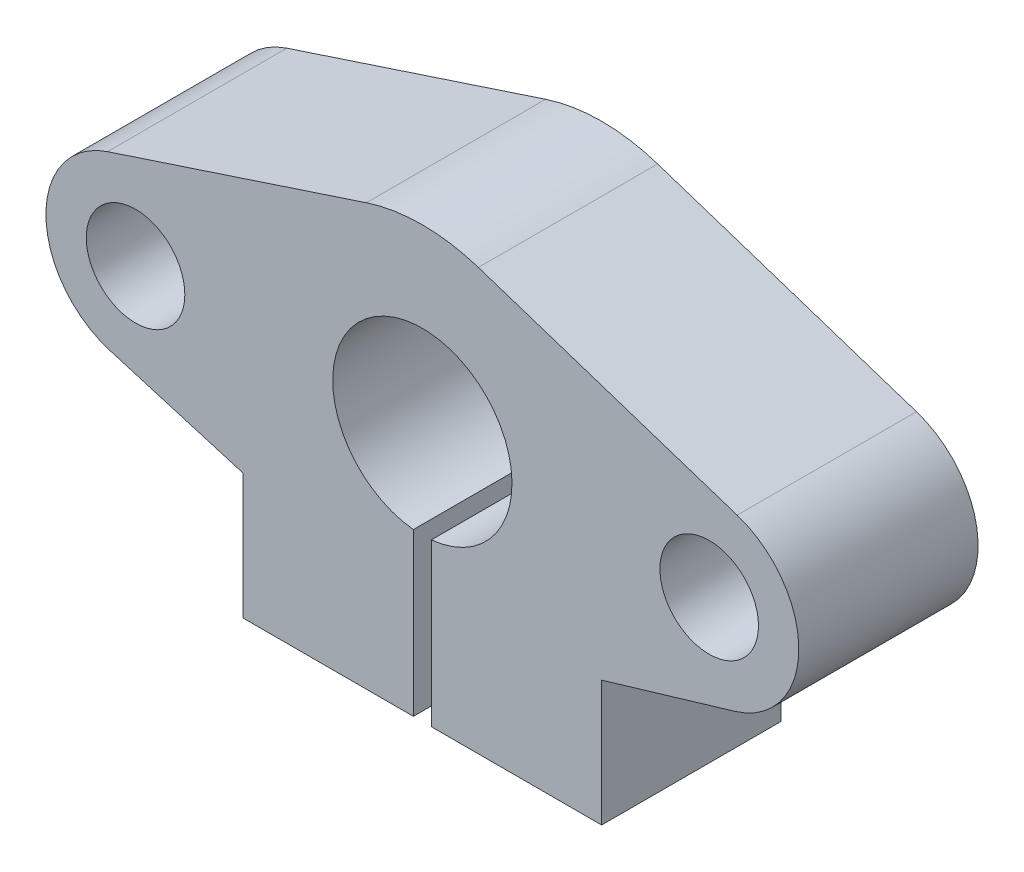
ISO-10303-21;
HEADER;
FILE_DESCRIPTION(('STEP AP214'),'2;1');
FILE_NAME('part.step','',(''),(''),'','','');
FILE_SCHEMA(('AUTOMOTIVE_DESIGN { 1 0 10303 214 1 1 1 1 }'));
ENDSEC;
DATA;
#1=APPLICATION_CONTEXT('core data for automotive mechanical design processes');
#2=APPLICATION_PROTOCOL_DEFINITION('international standard','automotive_design',2000,#1);
#3=PRODUCT_CONTEXT('',#1,'mechanical');
#4=PRODUCT('Part','Part','',(#3));
#5=PRODUCT_RELATED_PRODUCT_CATEGORY('part','',(#4));
#6=PRODUCT_DEFINITION_FORMATION('','',#4);
#7=PRODUCT_DEFINITION_CONTEXT('part definition',#1,'design');
#8=PRODUCT_DEFINITION('design','',#6,#7);
#9=PRODUCT_DEFINITION_SHAPE('','',#8);
#10=(LENGTH_UNIT() NAMED_UNIT(*) SI_UNIT(.MILLI.,.METRE.));
#11=(NAMED_UNIT(*) PLANE_ANGLE_UNIT() SI_UNIT($,.RADIAN.));
#12=(NAMED_UNIT(*) SI_UNIT($,.STERADIAN.) SOLID_ANGLE_UNIT());
#13=UNCERTAINTY_MEASURE_WITH_UNIT(LENGTH_MEASURE(1.E-05),#10,'distance_accuracy_value','');
#14=(GEOMETRIC_REPRESENTATION_CONTEXT(3) GLOBAL_UNCERTAINTY_ASSIGNED_CONTEXT((#13)) GLOBAL_UNIT_ASSIGNED_CONTEXT((#10,
#11,#12)) REPRESENTATION_CONTEXT('',''));
#15=CARTESIAN_POINT('',(0.,0.,0.));
#16=DIRECTION('',(0.,0.,1.));
#17=DIRECTION('',(1.,0.,0.));
#18=AXIS2_PLACEMENT_3D('',#15,#16,#17);
#19=CARTESIAN_POINT('',(0.,0.,10.));
#20=DIRECTION('',(0.,0.,-1.));
#21=DIRECTION('',(-1.,0.,0.));
#22=AXIS2_PLACEMENT_3D('',#19,#20,#21);
#23=CYLINDRICAL_SURFACE('',#22,10.);
#24=CARTESIAN_POINT('',(0.,0.,0.));
#25=DIRECTION('',(0.,0.,1.));
#26=DIRECTION('',(1.,0.,0.));
#27=AXIS2_PLACEMENT_3D('',#24,#25,#26);
#28=CIRCLE('',#27,10.);
#29=CARTESIAN_POINT('',(3.125,9.49917759598166,0.));
#30=VERTEX_POINT('',#29);
#31=CARTESIAN_POINT('',(-3.125,9.49917759598166,0.));
#32=VERTEX_POINT('',#31);
#33=EDGE_CURVE('E176',#30,#32,#28,.T.);
#34=ORIENTED_EDGE('',*,*,#33,.T.);
#35=DIRECTION('',(0.,0.,-1.));
#36=VECTOR('',#35,1.);
#37=CARTESIAN_POINT('',(-3.125,9.49917759598166,10.));
#38=LINE('',#37,#36);
#39=CARTESIAN_POINT('',(-3.125,9.49917759598166,10.));
#40=VERTEX_POINT('',#39);
#41=EDGE_CURVE('E11',#40,#32,#38,.T.);
#42=ORIENTED_EDGE('',*,*,#41,.F.);
#43=CARTESIAN_POINT('',(0.,0.,10.));
#44=DIRECTION('',(0.,0.,1.));
#45=DIRECTION('',(1.,0.,0.));
#46=AXIS2_PLACEMENT_3D('',#43,#44,#45);
#47=CIRCLE('',#46,10.);
#48=CARTESIAN_POINT('',(3.125,9.49917759598166,10.));
#49=VERTEX_POINT('',#48);
#50=EDGE_CURVE('E110',#49,#40,#47,.T.);
#51=ORIENTED_EDGE('',*,*,#50,.F.);
#52=DIRECTION('',(0.,0.,-1.));
#53=VECTOR('',#52,1.);
#54=CARTESIAN_POINT('',(3.125,9.49917759598166,10.));
#55=LINE('',#54,#53);
#56=EDGE_CURVE('E54',#49,#30,#55,.T.);
#57=ORIENTED_EDGE('',*,*,#56,.T.);
#58=EDGE_LOOP('',(#34,#42,#51,#57));
#59=FACE_BOUND('',#58,.T.);
#60=ADVANCED_FACE('F38',(#59),#23,.T.);
#61=CARTESIAN_POINT('',(-3.125,9.49917759598167,10.));
#62=DIRECTION('',(-0.3125,0.949917759598166,0.));
#63=DIRECTION('',(-0.949917759598166,-0.3125,0.));
#64=AXIS2_PLACEMENT_3D('',#61,#62,#63);
#65=PLANE('',#64);
#66=DIRECTION('',(0.949917759598166,0.3125,0.));
#67=VECTOR('',#66,1.);
#68=CARTESIAN_POINT('',(-3.125,9.49917759598167,0.));
#69=LINE('',#68,#67);
#70=CARTESIAN_POINT('',(-17.5625,4.74958879799083,0.));
#71=VERTEX_POINT('',#70);
#72=EDGE_CURVE('E178',#71,#32,#69,.T.);
#73=ORIENTED_EDGE('',*,*,#72,.F.);
#74=DIRECTION('',(0.,0.,-1.));
#75=VECTOR('',#74,1.);
#76=CARTESIAN_POINT('',(-17.5625,4.74958879799083,10.));
#77=LINE('',#76,#75);
#78=CARTESIAN_POINT('',(-17.5625,4.74958879799083,10.));
#79=VERTEX_POINT('',#78);
#80=EDGE_CURVE('E46',#79,#71,#77,.T.);
#81=ORIENTED_EDGE('',*,*,#80,.F.);
#82=DIRECTION('',(0.949917759598166,0.3125,0.));
#83=VECTOR('',#82,1.);
#84=CARTESIAN_POINT('',(-3.125,9.49917759598167,10.));
#85=LINE('',#84,#83);
#86=EDGE_CURVE('E251',#79,#40,#85,.T.);
#87=ORIENTED_EDGE('',*,*,#86,.T.);
#88=ORIENTED_EDGE('',*,*,#41,.T.);
#89=EDGE_LOOP('',(#73,#81,#87,#88));
#90=FACE_BOUND('',#89,.T.);
#91=ADVANCED_FACE('F250',(#90),#65,.T.);
#92=CARTESIAN_POINT('',(-16.,0.,10.));
#93=DIRECTION('',(0.,0.,-1.));
#94=DIRECTION('',(-1.,0.,0.));
#95=AXIS2_PLACEMENT_3D('',#92,#93,#94);
#96=CYLINDRICAL_SURFACE('',#95,5.);
#97=CARTESIAN_POINT('',(-16.,0.,0.));
#98=DIRECTION('',(0.,0.,1.));
#99=DIRECTION('',(1.,0.,0.));
#100=AXIS2_PLACEMENT_3D('',#97,#98,#99);
#101=CIRCLE('',#100,5.);
#102=CARTESIAN_POINT('',(-17.4248098145238,-4.79269412673465,0.));
#103=VERTEX_POINT('',#102);
#104=EDGE_CURVE('E181',#71,#103,#101,.T.);
#105=ORIENTED_EDGE('',*,*,#104,.T.);
#106=DIRECTION('',(0.,0.,-1.));
#107=VECTOR('',#106,1.);
#108=CARTESIAN_POINT('',(-17.4248098145238,-4.79269412673465,10.));
#109=LINE('',#108,#107);
#110=CARTESIAN_POINT('',(-17.4248098145238,-4.79269412673465,10.));
#111=VERTEX_POINT('',#110);
#112=EDGE_CURVE('E236',#111,#103,#109,.T.);
#113=ORIENTED_EDGE('',*,*,#112,.F.);
#114=CARTESIAN_POINT('',(-16.,0.,10.));
#115=DIRECTION('',(0.,0.,1.));
#116=DIRECTION('',(1.,0.,0.));
#117=AXIS2_PLACEMENT_3D('',#114,#115,#116);
#118=CIRCLE('',#117,5.);
#119=EDGE_CURVE('E242',#79,#111,#118,.T.);
#120=ORIENTED_EDGE('',*,*,#119,.F.);
#121=ORIENTED_EDGE('',*,*,#80,.T.);
#122=EDGE_LOOP('',(#105,#113,#120,#121));
#123=FACE_BOUND('',#122,.T.);
#124=ADVANCED_FACE('F240',(#123),#96,.T.);
#125=CARTESIAN_POINT('',(-2.72406293936421,-9.16304780979505,10.));
#126=DIRECTION('',(-0.284961962904751,-0.958538825346929,0.));
#127=DIRECTION('',(0.95853882534693,-0.284961962904751,0.));
#128=AXIS2_PLACEMENT_3D('',#125,#126,#127);
#129=PLANE('',#128);
#130=DIRECTION('',(-0.95853882534693,0.284961962904751,0.));
#131=VECTOR('',#130,1.);
#132=CARTESIAN_POINT('',(-2.72406293936421,-9.16304780979505,0.));
#133=LINE('',#132,#131);
#134=CARTESIAN_POINT('',(-10.,-7.,0.));
#135=VERTEX_POINT('',#134);
#136=EDGE_CURVE('E184',#135,#103,#133,.T.);
#137=ORIENTED_EDGE('',*,*,#136,.F.);
#138=DIRECTION('',(0.,0.,-1.));
#139=VECTOR('',#138,1.);
#140=CARTESIAN_POINT('',(-10.,-7.,10.));
#141=LINE('',#140,#139);
#142=CARTESIAN_POINT('',(-10.,-7.,10.));
#143=VERTEX_POINT('',#142);
#144=EDGE_CURVE('E234',#143,#135,#141,.T.);
#145=ORIENTED_EDGE('',*,*,#144,.F.);
#146=DIRECTION('',(-0.95853882534693,0.284961962904751,0.));
#147=VECTOR('',#146,1.);
#148=CARTESIAN_POINT('',(-2.72406293936421,-9.16304780979505,10.));
#149=LINE('',#148,#147);
#150=EDGE_CURVE('E472',#143,#111,#149,.T.);
#151=ORIENTED_EDGE('',*,*,#150,.T.);
#152=ORIENTED_EDGE('',*,*,#112,.T.);
#153=EDGE_LOOP('',(#137,#145,#151,#152));
#154=FACE_BOUND('',#153,.T.);
#155=ADVANCED_FACE('F273',(#154),#129,.T.);
#156=CARTESIAN_POINT('',(-10.,0.,10.));
#157=DIRECTION('',(-1.,0.,0.));
#158=DIRECTION('',(0.,0.,1.));
#159=AXIS2_PLACEMENT_3D('',#156,#157,#158);
#160=PLANE('',#159);
#161=DIRECTION('',(0.,1.,0.));
#162=VECTOR('',#161,1.);
#163=CARTESIAN_POINT('',(-10.,0.,0.));
#164=LINE('',#163,#162);
#165=CARTESIAN_POINT('',(-10.,-14.,0.));
#166=VERTEX_POINT('',#165);
#167=EDGE_CURVE('E187',#166,#135,#164,.T.);
#168=ORIENTED_EDGE('',*,*,#167,.F.);
#169=DIRECTION('',(0.,0.,-1.));
#170=VECTOR('',#169,1.);
#171=CARTESIAN_POINT('',(-10.,-14.,10.));
#172=LINE('',#171,#170);
#173=CARTESIAN_POINT('',(-10.,-14.,10.));
#174=VERTEX_POINT('',#173);
#175=EDGE_CURVE('E232',#174,#166,#172,.T.);
#176=ORIENTED_EDGE('',*,*,#175,.F.);
#177=DIRECTION('',(0.,1.,0.));
#178=VECTOR('',#177,1.);
#179=CARTESIAN_POINT('',(-10.,0.,10.));
#180=LINE('',#179,#178);
#181=EDGE_CURVE('E469',#174,#143,#180,.T.);
#182=ORIENTED_EDGE('',*,*,#181,.T.);
#183=ORIENTED_EDGE('',*,*,#144,.T.);
#184=EDGE_LOOP('',(#168,#176,#182,#183));
#185=FACE_BOUND('',#184,.T.);
#186=ADVANCED_FACE('F278',(#185),#160,.T.);
#187=CARTESIAN_POINT('',(0.,-14.,10.));
#188=DIRECTION('',(0.,1.,0.));
#189=DIRECTION('',(0.,0.,1.));
#190=AXIS2_PLACEMENT_3D('',#187,#188,#189);
#191=PLANE('',#190);
#192=DIRECTION('',(1.,0.,0.));
#193=VECTOR('',#192,1.);
#194=CARTESIAN_POINT('',(0.,-14.,0.));
#195=LINE('',#194,#193);
#196=CARTESIAN_POINT('',(-0.5,-14.,0.));
#197=VERTEX_POINT('',#196);
#198=EDGE_CURVE('E190',#166,#197,#195,.T.);
#199=ORIENTED_EDGE('',*,*,#198,.T.);
#200=DIRECTION('',(0.,0.,-1.));
#201=VECTOR('',#200,1.);
#202=CARTESIAN_POINT('',(-0.5,-14.,10.));
#203=LINE('',#202,#201);
#204=CARTESIAN_POINT('',(-0.5,-14.,10.));
#205=VERTEX_POINT('',#204);
#206=EDGE_CURVE('E230',#205,#197,#203,.T.);
#207=ORIENTED_EDGE('',*,*,#206,.F.);
#208=DIRECTION('',(1.,0.,0.));
#209=VECTOR('',#208,1.);
#210=CARTESIAN_POINT('',(0.,-14.,10.));
#211=LINE('',#210,#209);
#212=EDGE_CURVE('E466',#174,#205,#211,.T.);
#213=ORIENTED_EDGE('',*,*,#212,.F.);
#214=ORIENTED_EDGE('',*,*,#175,.T.);
#215=EDGE_LOOP('',(#199,#207,#213,#214));
#216=FACE_BOUND('',#215,.T.);
#217=ADVANCED_FACE('F282',(#216),#191,.F.);
#218=CARTESIAN_POINT('',(-0.5,0.,10.));
#219=DIRECTION('',(1.,0.,0.));
#220=DIRECTION('',(0.,0.,-1.));
#221=AXIS2_PLACEMENT_3D('',#218,#219,#220);
#222=PLANE('',#221);
#223=DIRECTION('',(0.,-1.,0.));
#224=VECTOR('',#223,1.);
#225=CARTESIAN_POINT('',(-0.5,0.,0.));
#226=LINE('',#225,#224);
#227=CARTESIAN_POINT('',(-0.5,-4.9749371855331,0.));
#228=VERTEX_POINT('',#227);
#229=EDGE_CURVE('E193',#228,#197,#226,.T.);
#230=ORIENTED_EDGE('',*,*,#229,.F.);
#231=DIRECTION('',(0.,0.,-1.));
#232=VECTOR('',#231,1.);
#233=CARTESIAN_POINT('',(-0.5,-4.9749371855331,10.));
#234=LINE('',#233,#232);
#235=CARTESIAN_POINT('',(-0.5,-4.9749371855331,10.));
#236=VERTEX_POINT('',#235);
#237=EDGE_CURVE('E228',#236,#228,#234,.T.);
#238=ORIENTED_EDGE('',*,*,#237,.F.);
#239=DIRECTION('',(0.,-1.,0.));
#240=VECTOR('',#239,1.);
#241=CARTESIAN_POINT('',(-0.5,0.,10.));
#242=LINE('',#241,#240);
#243=EDGE_CURVE('E464',#236,#205,#242,.T.);
#244=ORIENTED_EDGE('',*,*,#243,.T.);
#245=ORIENTED_EDGE('',*,*,#206,.T.);
#246=EDGE_LOOP('',(#230,#238,#244,#245));
#247=FACE_BOUND('',#246,.T.);
#248=ADVANCED_FACE('F286',(#247),#222,.T.);
#249=CARTESIAN_POINT('',(0.,0.,10.));
#250=DIRECTION('',(0.,0.,-1.));
#251=DIRECTION('',(-1.,0.,0.));
#252=AXIS2_PLACEMENT_3D('',#249,#250,#251);
#253=CYLINDRICAL_SURFACE('',#252,5.);
#254=CARTESIAN_POINT('',(0.,0.,0.));
#255=DIRECTION('',(0.,0.,1.));
#256=DIRECTION('',(1.,0.,0.));
#257=AXIS2_PLACEMENT_3D('',#254,#255,#256);
#258=CIRCLE('',#257,5.);
#259=CARTESIAN_POINT('',(0.5,-4.9749371855331,0.));
#260=VERTEX_POINT('',#259);
#261=EDGE_CURVE('E196',#260,#228,#258,.T.);
#262=ORIENTED_EDGE('',*,*,#261,.F.);
#263=DIRECTION('',(0.,0.,-1.));
#264=VECTOR('',#263,1.);
#265=CARTESIAN_POINT('',(0.5,-4.9749371855331,10.));
#266=LINE('',#265,#264);
#267=CARTESIAN_POINT('',(0.5,-4.9749371855331,10.));
#268=VERTEX_POINT('',#267);
#269=EDGE_CURVE('E226',#268,#260,#266,.T.);
#270=ORIENTED_EDGE('',*,*,#269,.F.);
#271=CARTESIAN_POINT('',(0.,0.,10.));
#272=DIRECTION('',(0.,0.,1.));
#273=DIRECTION('',(1.,0.,0.));
#274=AXIS2_PLACEMENT_3D('',#271,#272,#273);
#275=CIRCLE('',#274,5.);
#276=EDGE_CURVE('E457',#268,#236,#275,.T.);
#277=ORIENTED_EDGE('',*,*,#276,.T.);
#278=ORIENTED_EDGE('',*,*,#237,.T.);
#279=EDGE_LOOP('',(#262,#270,#277,#278));
#280=FACE_BOUND('',#279,.T.);
#281=ADVANCED_FACE('F290',(#280),#253,.F.);
#282=CARTESIAN_POINT('',(0.5,0.,10.));
#283=DIRECTION('',(1.,0.,0.));
#284=DIRECTION('',(0.,0.,-1.));
#285=AXIS2_PLACEMENT_3D('',#282,#283,#284);
#286=PLANE('',#285);
#287=DIRECTION('',(0.,-1.,0.));
#288=VECTOR('',#287,1.);
#289=CARTESIAN_POINT('',(0.5,0.,0.));
#290=LINE('',#289,#288);
#291=CARTESIAN_POINT('',(0.5,-14.,0.));
#292=VERTEX_POINT('',#291);
#293=EDGE_CURVE('E199',#260,#292,#290,.T.);
#294=ORIENTED_EDGE('',*,*,#293,.T.);
#295=DIRECTION('',(0.,0.,-1.));
#296=VECTOR('',#295,1.);
#297=CARTESIAN_POINT('',(0.5,-14.,10.));
#298=LINE('',#297,#296);
#299=CARTESIAN_POINT('',(0.5,-14.,10.));
#300=VERTEX_POINT('',#299);
#301=EDGE_CURVE('E223',#300,#292,#298,.T.);
#302=ORIENTED_EDGE('',*,*,#301,.F.);
#303=DIRECTION('',(0.,-1.,0.));
#304=VECTOR('',#303,1.);
#305=CARTESIAN_POINT('',(0.5,0.,10.));
#306=LINE('',#305,#304);
#307=EDGE_CURVE('E454',#268,#300,#306,.T.);
#308=ORIENTED_EDGE('',*,*,#307,.F.);
#309=ORIENTED_EDGE('',*,*,#269,.T.);
#310=EDGE_LOOP('',(#294,#302,#308,#309));
#311=FACE_BOUND('',#310,.T.);
#312=ADVANCED_FACE('F294',(#311),#286,.F.);
#313=CARTESIAN_POINT('',(0.,-14.,10.));
#314=DIRECTION('',(0.,1.,0.));
#315=DIRECTION('',(0.,0.,1.));
#316=AXIS2_PLACEMENT_3D('',#313,#314,#315);
#317=PLANE('',#316);
#318=DIRECTION('',(1.,0.,0.));
#319=VECTOR('',#318,1.);
#320=CARTESIAN_POINT('',(0.,-14.,0.));
#321=LINE('',#320,#319);
#322=CARTESIAN_POINT('',(10.,-14.,0.));
#323=VERTEX_POINT('',#322);
#324=EDGE_CURVE('E201',#292,#323,#321,.T.);
#325=ORIENTED_EDGE('',*,*,#324,.T.);
#326=DIRECTION('',(0.,0.,-1.));
#327=VECTOR('',#326,1.);
#328=CARTESIAN_POINT('',(10.,-14.,10.));
#329=LINE('',#328,#327);
#330=CARTESIAN_POINT('',(10.,-14.,10.));
#331=VERTEX_POINT('',#330);
#332=EDGE_CURVE('E220',#331,#323,#329,.T.);
#333=ORIENTED_EDGE('',*,*,#332,.F.);
#334=DIRECTION('',(1.,0.,0.));
#335=VECTOR('',#334,1.);
#336=CARTESIAN_POINT('',(0.,-14.,10.));
#337=LINE('',#336,#335);
#338=EDGE_CURVE('E452',#300,#331,#337,.T.);
#339=ORIENTED_EDGE('',*,*,#338,.F.);
#340=ORIENTED_EDGE('',*,*,#301,.T.);
#341=EDGE_LOOP('',(#325,#333,#339,#340));
#342=FACE_BOUND('',#341,.T.);
#343=ADVANCED_FACE('F298',(#342),#317,.F.);
#344=CARTESIAN_POINT('',(10.,0.,10.));
#345=DIRECTION('',(-1.,0.,0.));
#346=DIRECTION('',(0.,0.,1.));
#347=AXIS2_PLACEMENT_3D('',#344,#345,#346);
#348=PLANE('',#347);
#349=DIRECTION('',(0.,1.,0.));
#350=VECTOR('',#349,1.);
#351=CARTESIAN_POINT('',(10.,0.,0.));
#352=LINE('',#351,#350);
#353=CARTESIAN_POINT('',(10.,-7.,0.));
#354=VERTEX_POINT('',#353);
#355=EDGE_CURVE('E203',#323,#354,#352,.T.);
#356=ORIENTED_EDGE('',*,*,#355,.T.);
#357=DIRECTION('',(0.,0.,-1.));
#358=VECTOR('',#357,1.);
#359=CARTESIAN_POINT('',(10.,-7.,10.));
#360=LINE('',#359,#358);
#361=CARTESIAN_POINT('',(10.,-7.,10.));
#362=VERTEX_POINT('',#361);
#363=EDGE_CURVE('E162',#362,#354,#360,.T.);
#364=ORIENTED_EDGE('',*,*,#363,.F.);
#365=DIRECTION('',(0.,1.,0.));
#366=VECTOR('',#365,1.);
#367=CARTESIAN_POINT('',(10.,0.,10.));
#368=LINE('',#367,#366);
#369=EDGE_CURVE('E150',#331,#362,#368,.T.);
#370=ORIENTED_EDGE('',*,*,#369,.F.);
#371=ORIENTED_EDGE('',*,*,#332,.T.);
#372=EDGE_LOOP('',(#356,#364,#370,#371));
#373=FACE_BOUND('',#372,.T.);
#374=ADVANCED_FACE('F302',(#373),#348,.F.);
#375=CARTESIAN_POINT('',(2.72406293936421,-9.16304780979505,10.));
#376=DIRECTION('',(-0.284961962904751,0.95853882534693,0.));
#377=DIRECTION('',(-0.95853882534693,-0.284961962904751,0.));
#378=AXIS2_PLACEMENT_3D('',#375,#376,#377);
#379=PLANE('',#378);
#380=DIRECTION('',(0.95853882534693,0.284961962904751,0.));
#381=VECTOR('',#380,1.);
#382=CARTESIAN_POINT('',(2.72406293936421,-9.16304780979505,0.));
#383=LINE('',#382,#381);
#384=CARTESIAN_POINT('',(17.4248098145238,-4.79269412673465,0.));
#385=VERTEX_POINT('',#384);
#386=EDGE_CURVE('E159',#354,#385,#383,.T.);
#387=ORIENTED_EDGE('',*,*,#386,.T.);
#388=DIRECTION('',(0.,0.,-1.));
#389=VECTOR('',#388,1.);
#390=CARTESIAN_POINT('',(17.4248098145238,-4.79269412673465,10.));
#391=LINE('',#390,#389);
#392=CARTESIAN_POINT('',(17.4248098145238,-4.79269412673465,10.));
#393=VERTEX_POINT('',#392);
#394=EDGE_CURVE('E156',#393,#385,#391,.T.);
#395=ORIENTED_EDGE('',*,*,#394,.F.);
#396=DIRECTION('',(0.95853882534693,0.284961962904751,0.));
#397=VECTOR('',#396,1.);
#398=CARTESIAN_POINT('',(2.72406293936421,-9.16304780979505,10.));
#399=LINE('',#398,#397);
#400=EDGE_CURVE('E143',#362,#393,#399,.T.);
#401=ORIENTED_EDGE('',*,*,#400,.F.);
#402=ORIENTED_EDGE('',*,*,#363,.T.);
#403=EDGE_LOOP('',(#387,#395,#401,#402));
#404=FACE_BOUND('',#403,.T.);
#405=ADVANCED_FACE('F157',(#404),#379,.F.);
#406=CARTESIAN_POINT('',(16.,0.,10.));
#407=DIRECTION('',(0.,0.,-1.));
#408=DIRECTION('',(-1.,0.,0.));
#409=AXIS2_PLACEMENT_3D('',#406,#407,#408);
#410=CYLINDRICAL_SURFACE('',#409,5.);
#411=CARTESIAN_POINT('',(16.,0.,0.));
#412=DIRECTION('',(0.,0.,1.));
#413=DIRECTION('',(1.,0.,0.));
#414=AXIS2_PLACEMENT_3D('',#411,#412,#413);
#415=CIRCLE('',#414,5.);
#416=CARTESIAN_POINT('',(17.5625,4.74958879799083,0.));
#417=VERTEX_POINT('',#416);
#418=EDGE_CURVE('E206',#385,#417,#415,.T.);
#419=ORIENTED_EDGE('',*,*,#418,.T.);
#420=DIRECTION('',(0.,0.,-1.));
#421=VECTOR('',#420,1.);
#422=CARTESIAN_POINT('',(17.5625,4.74958879799083,10.));
#423=LINE('',#422,#421);
#424=CARTESIAN_POINT('',(17.5625,4.74958879799083,10.));
#425=VERTEX_POINT('',#424);
#426=EDGE_CURVE('E98',#425,#417,#423,.T.);
#427=ORIENTED_EDGE('',*,*,#426,.F.);
#428=CARTESIAN_POINT('',(16.,0.,10.));
#429=DIRECTION('',(0.,0.,1.));
#430=DIRECTION('',(1.,0.,0.));
#431=AXIS2_PLACEMENT_3D('',#428,#429,#430);
#432=CIRCLE('',#431,5.);
#433=EDGE_CURVE('E148',#393,#425,#432,.T.);
#434=ORIENTED_EDGE('',*,*,#433,.F.);
#435=ORIENTED_EDGE('',*,*,#394,.T.);
#436=EDGE_LOOP('',(#419,#427,#434,#435));
#437=FACE_BOUND('',#436,.T.);
#438=ADVANCED_FACE('F164',(#437),#410,.T.);
#439=CARTESIAN_POINT('',(16.,0.,10.));
#440=DIRECTION('',(0.,0.,-1.));
#441=DIRECTION('',(-1.,0.,0.));
#442=AXIS2_PLACEMENT_3D('',#439,#440,#441);
#443=CYLINDRICAL_SURFACE('',#442,2.75);
#444=CARTESIAN_POINT('',(16.,0.,10.));
#445=DIRECTION('',(0.,0.,1.));
#446=DIRECTION('',(1.,0.,0.));
#447=AXIS2_PLACEMENT_3D('',#444,#445,#446);
#448=CIRCLE('',#447,2.75);
#449=CARTESIAN_POINT('',(18.75,0.,10.));
#450=VERTEX_POINT('',#449);
#451=EDGE_CURVE('E167',#450,#450,#448,.T.);
#452=ORIENTED_EDGE('',*,*,#451,.T.);
#453=EDGE_LOOP('',(#452));
#454=FACE_BOUND('',#453,.T.);
#455=CARTESIAN_POINT('',(16.,0.,0.));
#456=DIRECTION('',(0.,0.,1.));
#457=DIRECTION('',(1.,0.,0.));
#458=AXIS2_PLACEMENT_3D('',#455,#456,#457);
#459=CIRCLE('',#458,2.75);
#460=CARTESIAN_POINT('',(18.75,0.,0.));
#461=VERTEX_POINT('',#460);
#462=EDGE_CURVE('E211',#461,#461,#459,.T.);
#463=ORIENTED_EDGE('',*,*,#462,.F.);
#464=EDGE_LOOP('',(#463));
#465=FACE_BOUND('',#464,.T.);
#466=ADVANCED_FACE('F255',(#454,#465),#443,.F.);
#467=CARTESIAN_POINT('',(3.125,9.49917759598166,10.));
#468=DIRECTION('',(0.3125,0.949917759598166,0.));
#469=DIRECTION('',(-0.949917759598166,0.3125,0.));
#470=AXIS2_PLACEMENT_3D('',#467,#468,#469);
#471=PLANE('',#470);
#472=DIRECTION('',(0.949917759598166,-0.3125,0.));
#473=VECTOR('',#472,1.);
#474=CARTESIAN_POINT('',(3.125,9.49917759598166,0.));
#475=LINE('',#474,#473);
#476=EDGE_CURVE('E208',#30,#417,#475,.T.);
#477=ORIENTED_EDGE('',*,*,#476,.F.);
#478=ORIENTED_EDGE('',*,*,#56,.F.);
#479=DIRECTION('',(0.949917759598166,-0.3125,0.));
#480=VECTOR('',#479,1.);
#481=CARTESIAN_POINT('',(3.125,9.49917759598166,10.));
#482=LINE('',#481,#480);
#483=EDGE_CURVE('E165',#49,#425,#482,.T.);
#484=ORIENTED_EDGE('',*,*,#483,.T.);
#485=ORIENTED_EDGE('',*,*,#426,.T.);
#486=EDGE_LOOP('',(#477,#478,#484,#485));
#487=FACE_BOUND('',#486,.T.);
#488=ADVANCED_FACE('F252',(#487),#471,.T.);
#489=CARTESIAN_POINT('',(-16.,0.,10.));
#490=DIRECTION('',(0.,0.,-1.));
#491=DIRECTION('',(-1.,0.,0.));
#492=AXIS2_PLACEMENT_3D('',#489,#490,#491);
#493=CYLINDRICAL_SURFACE('',#492,2.75);
#494=CARTESIAN_POINT('',(-16.,0.,10.));
#495=DIRECTION('',(0.,0.,1.));
#496=DIRECTION('',(1.,0.,0.));
#497=AXIS2_PLACEMENT_3D('',#494,#495,#496);
#498=CIRCLE('',#497,2.75);
#499=CARTESIAN_POINT('',(-13.25,0.,10.));
#500=VERTEX_POINT('',#499);
#501=EDGE_CURVE('E173',#500,#500,#498,.T.);
#502=ORIENTED_EDGE('',*,*,#501,.T.);
#503=EDGE_LOOP('',(#502));
#504=FACE_BOUND('',#503,.T.);
#505=CARTESIAN_POINT('',(-16.,0.,0.));
#506=DIRECTION('',(0.,0.,1.));
#507=DIRECTION('',(1.,0.,0.));
#508=AXIS2_PLACEMENT_3D('',#505,#506,#507);
#509=CIRCLE('',#508,2.75);
#510=CARTESIAN_POINT('',(-13.25,0.,0.));
#511=VERTEX_POINT('',#510);
#512=EDGE_CURVE('E214',#511,#511,#509,.T.);
#513=ORIENTED_EDGE('',*,*,#512,.F.);
#514=EDGE_LOOP('',(#513));
#515=FACE_BOUND('',#514,.T.);
#516=ADVANCED_FACE('F254',(#504,#515),#493,.F.);
#517=CARTESIAN_POINT('',(0.,0.,10.));
#518=DIRECTION('',(0.,0.,1.));
#519=DIRECTION('',(1.,0.,0.));
#520=AXIS2_PLACEMENT_3D('',#517,#518,#519);
#521=PLANE('',#520);
#522=ORIENTED_EDGE('',*,*,#50,.T.);
#523=ORIENTED_EDGE('',*,*,#86,.F.);
#524=ORIENTED_EDGE('',*,*,#119,.T.);
#525=ORIENTED_EDGE('',*,*,#150,.F.);
#526=ORIENTED_EDGE('',*,*,#181,.F.);
#527=ORIENTED_EDGE('',*,*,#212,.T.);
#528=ORIENTED_EDGE('',*,*,#243,.F.);
#529=ORIENTED_EDGE('',*,*,#276,.F.);
#530=ORIENTED_EDGE('',*,*,#307,.T.);
#531=ORIENTED_EDGE('',*,*,#338,.T.);
#532=ORIENTED_EDGE('',*,*,#369,.T.);
#533=ORIENTED_EDGE('',*,*,#400,.T.);
#534=ORIENTED_EDGE('',*,*,#433,.T.);
#535=ORIENTED_EDGE('',*,*,#483,.F.);
#536=EDGE_LOOP('',(#522,#523,#524,#525,#526,#527,#528,#529,#530,#531,#532,#533,#534,#535));
#537=FACE_BOUND('',#536,.T.);
#538=ORIENTED_EDGE('',*,*,#451,.F.);
#539=EDGE_LOOP('',(#538));
#540=FACE_BOUND('',#539,.T.);
#541=ORIENTED_EDGE('',*,*,#501,.F.);
#542=EDGE_LOOP('',(#541));
#543=FACE_BOUND('',#542,.T.);
#544=ADVANCED_FACE('F145',(#537,#540,#543),#521,.T.);
#545=CARTESIAN_POINT('',(0.,0.,0.));
#546=DIRECTION('',(0.,0.,1.));
#547=DIRECTION('',(1.,0.,0.));
#548=AXIS2_PLACEMENT_3D('',#545,#546,#547);
#549=PLANE('',#548);
#550=ORIENTED_EDGE('',*,*,#33,.F.);
#551=ORIENTED_EDGE('',*,*,#476,.T.);
#552=ORIENTED_EDGE('',*,*,#418,.F.);
#553=ORIENTED_EDGE('',*,*,#386,.F.);
#554=ORIENTED_EDGE('',*,*,#355,.F.);
#555=ORIENTED_EDGE('',*,*,#324,.F.);
#556=ORIENTED_EDGE('',*,*,#293,.F.);
#557=ORIENTED_EDGE('',*,*,#261,.T.);
#558=ORIENTED_EDGE('',*,*,#229,.T.);
#559=ORIENTED_EDGE('',*,*,#198,.F.);
#560=ORIENTED_EDGE('',*,*,#167,.T.);
#561=ORIENTED_EDGE('',*,*,#136,.T.);
#562=ORIENTED_EDGE('',*,*,#104,.F.);
#563=ORIENTED_EDGE('',*,*,#72,.T.);
#564=EDGE_LOOP('',(#550,#551,#552,#553,#554,#555,#556,#557,#558,#559,#560,#561,#562,#563));
#565=FACE_BOUND('',#564,.T.);
#566=ORIENTED_EDGE('',*,*,#462,.T.);
#567=EDGE_LOOP('',(#566));
#568=FACE_BOUND('',#567,.T.);
#569=ORIENTED_EDGE('',*,*,#512,.T.);
#570=EDGE_LOOP('',(#569));
#571=FACE_BOUND('',#570,.T.);
#572=ADVANCED_FACE('F247',(#565,#568,#571),#549,.F.);
#573=CLOSED_SHELL('',(#60,#91,#124,#155,#186,#217,#248,#281,#312,#343,#374,#405,#438,#466,#488,
#516,#544,#572));
#574=MANIFOLD_SOLID_BREP('B2',#573);
#575=ADVANCED_BREP_SHAPE_REPRESENTATION('',(#18,#574),#14);
#576=SHAPE_DEFINITION_REPRESENTATION(#9,#575);
ENDSEC;
END-ISO-10303-21;
